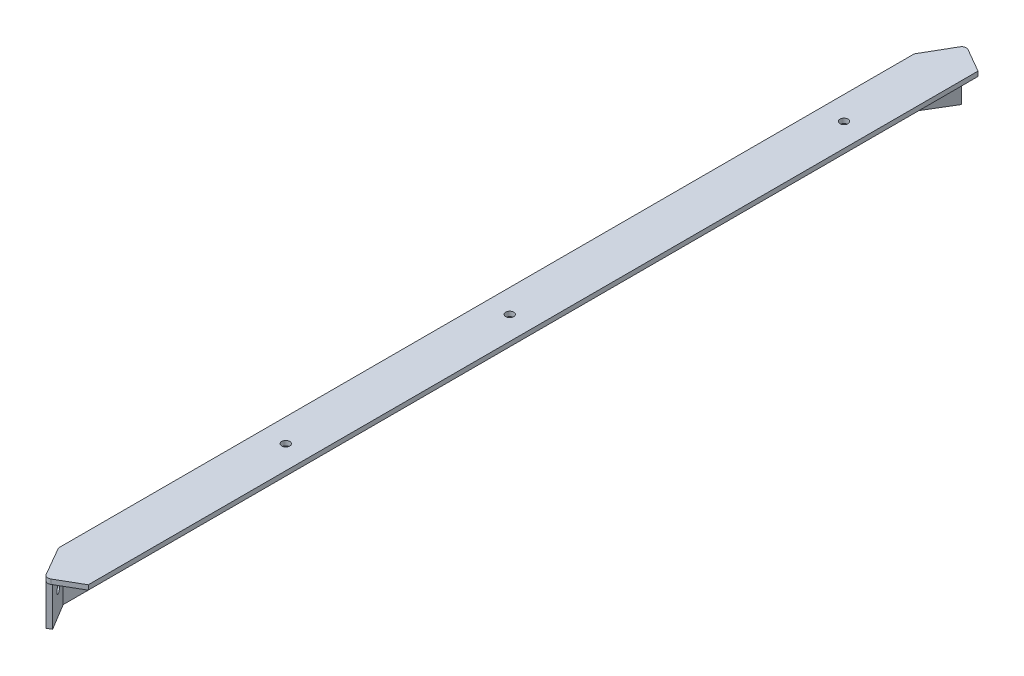
ISO-10303-21;
HEADER;
FILE_DESCRIPTION(('STEP AP214'),'2;1');
FILE_NAME('part.step','',(''),(''),'','','');
FILE_SCHEMA(('AUTOMOTIVE_DESIGN { 1 0 10303 214 1 1 1 1 }'));
ENDSEC;
DATA;
#1=APPLICATION_CONTEXT('core data for automotive mechanical design processes');
#2=APPLICATION_PROTOCOL_DEFINITION('international standard','automotive_design',2000,#1);
#3=PRODUCT_CONTEXT('',#1,'mechanical');
#4=PRODUCT('Part','Part','',(#3));
#5=PRODUCT_RELATED_PRODUCT_CATEGORY('part','',(#4));
#6=PRODUCT_DEFINITION_FORMATION('','',#4);
#7=PRODUCT_DEFINITION_CONTEXT('part definition',#1,'design');
#8=PRODUCT_DEFINITION('design','',#6,#7);
#9=PRODUCT_DEFINITION_SHAPE('','',#8);
#10=(LENGTH_UNIT() NAMED_UNIT(*) SI_UNIT(.MILLI.,.METRE.));
#11=(NAMED_UNIT(*) PLANE_ANGLE_UNIT() SI_UNIT($,.RADIAN.));
#12=(NAMED_UNIT(*) SI_UNIT($,.STERADIAN.) SOLID_ANGLE_UNIT());
#13=UNCERTAINTY_MEASURE_WITH_UNIT(LENGTH_MEASURE(1.E-05),#10,'distance_accuracy_value','');
#14=(GEOMETRIC_REPRESENTATION_CONTEXT(3) GLOBAL_UNCERTAINTY_ASSIGNED_CONTEXT((#13)) GLOBAL_UNIT_ASSIGNED_CONTEXT((#10,
#11,#12)) REPRESENTATION_CONTEXT('',''));
#15=CARTESIAN_POINT('',(0.,0.,0.));
#16=DIRECTION('',(0.,0.,1.));
#17=DIRECTION('',(1.,0.,0.));
#18=AXIS2_PLACEMENT_3D('',#15,#16,#17);
#19=CARTESIAN_POINT('',(7.,0.,640.));
#20=DIRECTION('',(0.,1.,0.));
#21=DIRECTION('',(-1.,0.,0.));
#22=AXIS2_PLACEMENT_3D('',#19,#20,#21);
#23=PLANE('',#22);
#24=DIRECTION('',(0.,0.,-1.));
#25=VECTOR('',#24,1.);
#26=CARTESIAN_POINT('',(0.,0.,640.));
#27=LINE('',#26,#25);
#28=CARTESIAN_POINT('',(0.,0.,640.));
#29=VERTEX_POINT('',#28);
#30=CARTESIAN_POINT('',(0.,0.,-640.));
#31=VERTEX_POINT('',#30);
#32=EDGE_CURVE('E305',#29,#31,#27,.T.);
#33=ORIENTED_EDGE('',*,*,#32,.T.);
#34=DIRECTION('',(0.499999999999995,0.,-0.866025403784441));
#35=VECTOR('',#34,1.);
#36=CARTESIAN_POINT('',(0.,0.,-640.));
#37=LINE('',#36,#35);
#38=CARTESIAN_POINT('',(24.9999999999997,0.,-683.301270189222));
#39=VERTEX_POINT('',#38);
#40=EDGE_CURVE('E164',#31,#39,#37,.T.);
#41=ORIENTED_EDGE('',*,*,#40,.T.);
#42=DIRECTION('',(0.86602540378444,0.,0.499999999999997));
#43=VECTOR('',#42,1.);
#44=CARTESIAN_POINT('',(24.9999999999997,0.,-683.301270189222));
#45=LINE('',#44,#43);
#46=CARTESIAN_POINT('',(31.0621778264906,0.,-679.801270189222));
#47=VERTEX_POINT('',#46);
#48=EDGE_CURVE('E208',#39,#47,#45,.T.);
#49=ORIENTED_EDGE('',*,*,#48,.T.);
#50=DIRECTION('',(-0.517360980401763,0.,0.855767267402608));
#51=VECTOR('',#50,1.);
#52=CARTESIAN_POINT('',(31.0621778264906,0.,-679.801270189222));
#53=LINE('',#52,#51);
#54=CARTESIAN_POINT('',(7.,0.,-640.));
#55=VERTEX_POINT('',#54);
#56=EDGE_CURVE('E204',#47,#55,#53,.T.);
#57=ORIENTED_EDGE('',*,*,#56,.T.);
#58=DIRECTION('',(0.,0.,-1.));
#59=VECTOR('',#58,1.);
#60=CARTESIAN_POINT('',(7.,0.,640.));
#61=LINE('',#60,#59);
#62=CARTESIAN_POINT('',(7.,0.,640.));
#63=VERTEX_POINT('',#62);
#64=EDGE_CURVE('E317',#63,#55,#61,.T.);
#65=ORIENTED_EDGE('',*,*,#64,.F.);
#66=DIRECTION('',(-0.517360980401763,0.,-0.855767267402608));
#67=VECTOR('',#66,1.);
#68=CARTESIAN_POINT('',(31.0621778264906,0.,679.801270189222));
#69=LINE('',#68,#67);
#70=CARTESIAN_POINT('',(31.0621778264906,0.,679.801270189222));
#71=VERTEX_POINT('',#70);
#72=EDGE_CURVE('E283',#71,#63,#69,.T.);
#73=ORIENTED_EDGE('',*,*,#72,.F.);
#74=DIRECTION('',(0.86602540378444,0.,-0.499999999999997));
#75=VECTOR('',#74,1.);
#76=CARTESIAN_POINT('',(24.9999999999997,0.,683.301270189222));
#77=LINE('',#76,#75);
#78=CARTESIAN_POINT('',(24.9999999999997,0.,683.301270189222));
#79=VERTEX_POINT('',#78);
#80=EDGE_CURVE('E286',#79,#71,#77,.T.);
#81=ORIENTED_EDGE('',*,*,#80,.F.);
#82=DIRECTION('',(0.499999999999995,0.,0.866025403784441));
#83=VECTOR('',#82,1.);
#84=CARTESIAN_POINT('',(0.,0.,640.));
#85=LINE('',#84,#83);
#86=EDGE_CURVE('E278',#29,#79,#85,.T.);
#87=ORIENTED_EDGE('',*,*,#86,.F.);
#88=EDGE_LOOP('',(#33,#41,#49,#57,#65,#73,#81,#87));
#89=FACE_BOUND('',#88,.T.);
#90=ADVANCED_FACE('F44',(#89),#23,.F.);
#91=CARTESIAN_POINT('',(6.99999999999999,63.,640.));
#92=DIRECTION('',(-1.,0.,0.));
#93=DIRECTION('',(0.,-1.,0.));
#94=AXIS2_PLACEMENT_3D('',#91,#92,#93);
#95=PLANE('',#94);
#96=ORIENTED_EDGE('',*,*,#64,.T.);
#97=DIRECTION('',(0.,1.,0.));
#98=VECTOR('',#97,1.);
#99=CARTESIAN_POINT('',(6.99999999999999,63.,-640.));
#100=LINE('',#99,#98);
#101=CARTESIAN_POINT('',(6.99999999999999,58.,-640.));
#102=VERTEX_POINT('',#101);
#103=EDGE_CURVE('E220',#55,#102,#100,.T.);
#104=ORIENTED_EDGE('',*,*,#103,.T.);
#105=DIRECTION('',(0.,0.,-1.));
#106=VECTOR('',#105,1.);
#107=CARTESIAN_POINT('',(6.99999999999999,58.,640.));
#108=LINE('',#107,#106);
#109=CARTESIAN_POINT('',(6.99999999999999,58.,640.));
#110=VERTEX_POINT('',#109);
#111=EDGE_CURVE('E54',#102,#110,#108,.F.);
#112=ORIENTED_EDGE('',*,*,#111,.T.);
#113=DIRECTION('',(0.,1.,0.));
#114=VECTOR('',#113,1.);
#115=CARTESIAN_POINT('',(6.99999999999999,63.,640.));
#116=LINE('',#115,#114);
#117=EDGE_CURVE('E299',#63,#110,#116,.T.);
#118=ORIENTED_EDGE('',*,*,#117,.F.);
#119=EDGE_LOOP('',(#96,#104,#112,#118));
#120=FACE_BOUND('',#119,.T.);
#121=ADVANCED_FACE('F355',(#120),#95,.F.);
#122=CARTESIAN_POINT('',(70.,63.,640.));
#123=DIRECTION('',(0.,1.,0.));
#124=DIRECTION('',(-1.,0.,0.));
#125=AXIS2_PLACEMENT_3D('',#122,#123,#124);
#126=PLANE('',#125);
#127=CARTESIAN_POINT('',(35.,63.,335.));
#128=DIRECTION('',(0.,1.,0.));
#129=DIRECTION('',(-1.,0.,0.));
#130=AXIS2_PLACEMENT_3D('',#127,#128,#129);
#131=CIRCLE('',#130,6.);
#132=CARTESIAN_POINT('',(29.,63.,335.));
#133=VERTEX_POINT('',#132);
#134=EDGE_CURVE('E240',#133,#133,#131,.T.);
#135=ORIENTED_EDGE('',*,*,#134,.T.);
#136=EDGE_LOOP('',(#135));
#137=FACE_BOUND('',#136,.T.);
#138=CARTESIAN_POINT('',(35.,63.,-500.));
#139=DIRECTION('',(0.,1.,0.));
#140=DIRECTION('',(-1.,0.,0.));
#141=AXIS2_PLACEMENT_3D('',#138,#139,#140);
#142=CIRCLE('',#141,6.);
#143=CARTESIAN_POINT('',(29.,63.,-500.));
#144=VERTEX_POINT('',#143);
#145=EDGE_CURVE('E551',#144,#144,#142,.T.);
#146=ORIENTED_EDGE('',*,*,#145,.T.);
#147=EDGE_LOOP('',(#146));
#148=FACE_BOUND('',#147,.T.);
#149=CARTESIAN_POINT('',(35.,63.,0.));
#150=DIRECTION('',(0.,1.,0.));
#151=DIRECTION('',(-1.,0.,0.));
#152=AXIS2_PLACEMENT_3D('',#149,#150,#151);
#153=CIRCLE('',#152,6.);
#154=CARTESIAN_POINT('',(29.,63.,0.));
#155=VERTEX_POINT('',#154);
#156=EDGE_CURVE('E555',#155,#155,#153,.T.);
#157=ORIENTED_EDGE('',*,*,#156,.T.);
#158=EDGE_LOOP('',(#157));
#159=FACE_BOUND('',#158,.T.);
#160=DIRECTION('',(0.86602540378444,0.,-0.499999999999997));
#161=VECTOR('',#160,1.);
#162=CARTESIAN_POINT('',(24.9999999999997,63.,683.301270189222));
#163=LINE('',#162,#161);
#164=CARTESIAN_POINT('',(24.9999999999997,63.,683.301270189222));
#165=VERTEX_POINT('',#164);
#166=CARTESIAN_POINT('',(35.3931854107218,63.,677.300761794604));
#167=VERTEX_POINT('',#166);
#168=EDGE_CURVE('E279',#165,#167,#163,.T.);
#169=ORIENTED_EDGE('',*,*,#168,.T.);
#170=DIRECTION('',(-0.517360980401763,0.,-0.855767267402608));
#171=VECTOR('',#170,1.);
#172=CARTESIAN_POINT('',(11.278836337013,63.,637.413195097991));
#173=LINE('',#172,#171);
#174=CARTESIAN_POINT('',(12.,63.,638.606072567694));
#175=VERTEX_POINT('',#174);
#176=EDGE_CURVE('E323',#167,#175,#173,.T.);
#177=ORIENTED_EDGE('',*,*,#176,.T.);
#178=DIRECTION('',(0.,0.,-1.));
#179=VECTOR('',#178,1.);
#180=CARTESIAN_POINT('',(12.,63.,0.));
#181=LINE('',#180,#179);
#182=CARTESIAN_POINT('',(12.,63.,-638.606072567694));
#183=VERTEX_POINT('',#182);
#184=EDGE_CURVE('E320',#175,#183,#181,.T.);
#185=ORIENTED_EDGE('',*,*,#184,.T.);
#186=DIRECTION('',(-0.517360980401763,0.,0.855767267402608));
#187=VECTOR('',#186,1.);
#188=CARTESIAN_POINT('',(11.278836337013,63.,-637.413195097991));
#189=LINE('',#188,#187);
#190=CARTESIAN_POINT('',(35.3931854107218,63.,-677.300761794604));
#191=VERTEX_POINT('',#190);
#192=EDGE_CURVE('E225',#191,#183,#189,.T.);
#193=ORIENTED_EDGE('',*,*,#192,.F.);
#194=DIRECTION('',(0.86602540378444,0.,0.499999999999997));
#195=VECTOR('',#194,1.);
#196=CARTESIAN_POINT('',(24.9999999999997,63.,-683.301270189222));
#197=LINE('',#196,#195);
#198=CARTESIAN_POINT('',(24.9999999999997,63.,-683.301270189222));
#199=VERTEX_POINT('',#198);
#200=EDGE_CURVE('E199',#199,#191,#197,.T.);
#201=ORIENTED_EDGE('',*,*,#200,.F.);
#202=CARTESIAN_POINT('',(31.0621778264908,63.,-679.801270189222));
#203=DIRECTION('',(0.,-1.,0.));
#204=DIRECTION('',(0.,0.,-1.));
#205=AXIS2_PLACEMENT_3D('',#202,#203,#204);
#206=CIRCLE('',#205,7.00000000000002);
#207=CARTESIAN_POINT('',(34.5621778264908,63.,-685.863448015713));
#208=VERTEX_POINT('',#207);
#209=EDGE_CURVE('E160',#199,#208,#206,.T.);
#210=ORIENTED_EDGE('',*,*,#209,.T.);
#211=DIRECTION('',(0.866025403784439,0.,0.499999999999999));
#212=VECTOR('',#211,1.);
#213=CARTESIAN_POINT('',(34.5621778264908,63.,-685.863448015713));
#214=LINE('',#213,#212);
#215=CARTESIAN_POINT('',(69.9999999999999,63.,-665.403411844344));
#216=VERTEX_POINT('',#215);
#217=EDGE_CURVE('E176',#208,#216,#214,.T.);
#218=ORIENTED_EDGE('',*,*,#217,.T.);
#219=DIRECTION('',(0.,0.,-1.));
#220=VECTOR('',#219,1.);
#221=CARTESIAN_POINT('',(70.,63.,640.));
#222=LINE('',#221,#220);
#223=CARTESIAN_POINT('',(69.9999999999999,63.,665.403411844344));
#224=VERTEX_POINT('',#223);
#225=EDGE_CURVE('E314',#224,#216,#222,.T.);
#226=ORIENTED_EDGE('',*,*,#225,.F.);
#227=DIRECTION('',(0.866025403784439,0.,-0.499999999999999));
#228=VECTOR('',#227,1.);
#229=CARTESIAN_POINT('',(34.5621778264908,63.,685.863448015713));
#230=LINE('',#229,#228);
#231=CARTESIAN_POINT('',(34.5621778264908,63.,685.863448015713));
#232=VERTEX_POINT('',#231);
#233=EDGE_CURVE('E254',#232,#224,#230,.T.);
#234=ORIENTED_EDGE('',*,*,#233,.F.);
#235=CARTESIAN_POINT('',(31.0621778264908,63.,679.801270189222));
#236=DIRECTION('',(0.,1.,0.));
#237=DIRECTION('',(0.,0.,1.));
#238=AXIS2_PLACEMENT_3D('',#235,#236,#237);
#239=CIRCLE('',#238,7.00000000000002);
#240=EDGE_CURVE('E249',#165,#232,#239,.T.);
#241=ORIENTED_EDGE('',*,*,#240,.F.);
#242=EDGE_LOOP('',(#169,#177,#185,#193,#201,#210,#218,#226,#234,#241));
#243=FACE_BOUND('',#242,.T.);
#244=ADVANCED_FACE('F341',(#137,#148,#159,#243),#126,.F.);
#245=CARTESIAN_POINT('',(70.,70.,640.));
#246=DIRECTION('',(-1.,0.,0.));
#247=DIRECTION('',(0.,0.,1.));
#248=AXIS2_PLACEMENT_3D('',#245,#246,#247);
#249=PLANE('',#248);
#250=ORIENTED_EDGE('',*,*,#225,.T.);
#251=DIRECTION('',(0.,-1.,0.));
#252=VECTOR('',#251,1.);
#253=CARTESIAN_POINT('',(69.9999999999999,70.,-665.403411844344));
#254=LINE('',#253,#252);
#255=CARTESIAN_POINT('',(69.9999999999999,70.,-665.403411844344));
#256=VERTEX_POINT('',#255);
#257=EDGE_CURVE('E184',#256,#216,#254,.T.);
#258=ORIENTED_EDGE('',*,*,#257,.F.);
#259=DIRECTION('',(0.,0.,-1.));
#260=VECTOR('',#259,1.);
#261=CARTESIAN_POINT('',(70.,70.,640.));
#262=LINE('',#261,#260);
#263=CARTESIAN_POINT('',(69.9999999999999,70.,665.403411844344));
#264=VERTEX_POINT('',#263);
#265=EDGE_CURVE('E311',#264,#256,#262,.T.);
#266=ORIENTED_EDGE('',*,*,#265,.F.);
#267=DIRECTION('',(0.,-1.,0.));
#268=VECTOR('',#267,1.);
#269=CARTESIAN_POINT('',(69.9999999999999,70.,665.403411844344));
#270=LINE('',#269,#268);
#271=EDGE_CURVE('E261',#264,#224,#270,.T.);
#272=ORIENTED_EDGE('',*,*,#271,.T.);
#273=EDGE_LOOP('',(#250,#258,#266,#272));
#274=FACE_BOUND('',#273,.T.);
#275=ADVANCED_FACE('F387',(#274),#249,.F.);
#276=CARTESIAN_POINT('',(0.,70.,640.));
#277=DIRECTION('',(0.,-1.,0.));
#278=DIRECTION('',(0.,0.,-1.));
#279=AXIS2_PLACEMENT_3D('',#276,#277,#278);
#280=PLANE('',#279);
#281=CARTESIAN_POINT('',(35.,70.,335.));
#282=DIRECTION('',(0.,1.,0.));
#283=DIRECTION('',(0.,0.,1.));
#284=AXIS2_PLACEMENT_3D('',#281,#282,#283);
#285=CIRCLE('',#284,6.);
#286=CARTESIAN_POINT('',(35.,70.,341.));
#287=VERTEX_POINT('',#286);
#288=EDGE_CURVE('E547',#287,#287,#285,.T.);
#289=ORIENTED_EDGE('',*,*,#288,.F.);
#290=EDGE_LOOP('',(#289));
#291=FACE_BOUND('',#290,.T.);
#292=CARTESIAN_POINT('',(35.,70.,-500.));
#293=DIRECTION('',(0.,1.,0.));
#294=DIRECTION('',(0.,0.,1.));
#295=AXIS2_PLACEMENT_3D('',#292,#293,#294);
#296=CIRCLE('',#295,6.);
#297=CARTESIAN_POINT('',(35.,70.,-494.));
#298=VERTEX_POINT('',#297);
#299=EDGE_CURVE('E573',#298,#298,#296,.T.);
#300=ORIENTED_EDGE('',*,*,#299,.F.);
#301=EDGE_LOOP('',(#300));
#302=FACE_BOUND('',#301,.T.);
#303=CARTESIAN_POINT('',(35.,70.,0.));
#304=DIRECTION('',(0.,1.,0.));
#305=DIRECTION('',(0.,0.,1.));
#306=AXIS2_PLACEMENT_3D('',#303,#304,#305);
#307=CIRCLE('',#306,6.);
#308=CARTESIAN_POINT('',(35.,70.,6.));
#309=VERTEX_POINT('',#308);
#310=EDGE_CURVE('E569',#309,#309,#307,.T.);
#311=ORIENTED_EDGE('',*,*,#310,.F.);
#312=EDGE_LOOP('',(#311));
#313=FACE_BOUND('',#312,.T.);
#314=ORIENTED_EDGE('',*,*,#265,.T.);
#315=DIRECTION('',(0.866025403784439,0.,0.499999999999999));
#316=VECTOR('',#315,1.);
#317=CARTESIAN_POINT('',(34.5621778264908,70.,-685.863448015713));
#318=LINE('',#317,#316);
#319=CARTESIAN_POINT('',(34.5621778264908,70.,-685.863448015713));
#320=VERTEX_POINT('',#319);
#321=EDGE_CURVE('E180',#320,#256,#318,.T.);
#322=ORIENTED_EDGE('',*,*,#321,.F.);
#323=CARTESIAN_POINT('',(31.0621778264908,70.,-679.801270189222));
#324=DIRECTION('',(0.,-1.,0.));
#325=DIRECTION('',(0.,0.,-1.));
#326=AXIS2_PLACEMENT_3D('',#323,#324,#325);
#327=CIRCLE('',#326,7.00000000000002);
#328=CARTESIAN_POINT('',(24.9999999999997,70.,-683.301270189222));
#329=VERTEX_POINT('',#328);
#330=EDGE_CURVE('E157',#329,#320,#327,.T.);
#331=ORIENTED_EDGE('',*,*,#330,.F.);
#332=DIRECTION('',(0.499999999999996,0.,-0.866025403784441));
#333=VECTOR('',#332,1.);
#334=CARTESIAN_POINT('',(0.,70.,-640.));
#335=LINE('',#334,#333);
#336=CARTESIAN_POINT('',(0.,70.,-640.));
#337=VERTEX_POINT('',#336);
#338=EDGE_CURVE('E169',#337,#329,#335,.T.);
#339=ORIENTED_EDGE('',*,*,#338,.F.);
#340=DIRECTION('',(0.,0.,-1.));
#341=VECTOR('',#340,1.);
#342=CARTESIAN_POINT('',(0.,70.,640.));
#343=LINE('',#342,#341);
#344=CARTESIAN_POINT('',(0.,70.,640.));
#345=VERTEX_POINT('',#344);
#346=EDGE_CURVE('E308',#345,#337,#343,.T.);
#347=ORIENTED_EDGE('',*,*,#346,.F.);
#348=DIRECTION('',(0.499999999999996,0.,0.866025403784441));
#349=VECTOR('',#348,1.);
#350=CARTESIAN_POINT('',(0.,70.,640.));
#351=LINE('',#350,#349);
#352=CARTESIAN_POINT('',(24.9999999999997,70.,683.301270189222));
#353=VERTEX_POINT('',#352);
#354=EDGE_CURVE('E250',#345,#353,#351,.T.);
#355=ORIENTED_EDGE('',*,*,#354,.T.);
#356=CARTESIAN_POINT('',(31.0621778264908,70.,679.801270189222));
#357=DIRECTION('',(0.,1.,0.));
#358=DIRECTION('',(0.,0.,1.));
#359=AXIS2_PLACEMENT_3D('',#356,#357,#358);
#360=CIRCLE('',#359,7.00000000000002);
#361=CARTESIAN_POINT('',(34.5621778264908,70.,685.863448015713));
#362=VERTEX_POINT('',#361);
#363=EDGE_CURVE('E253',#353,#362,#360,.T.);
#364=ORIENTED_EDGE('',*,*,#363,.T.);
#365=DIRECTION('',(0.866025403784439,0.,-0.499999999999999));
#366=VECTOR('',#365,1.);
#367=CARTESIAN_POINT('',(34.5621778264908,70.,685.863448015713));
#368=LINE('',#367,#366);
#369=EDGE_CURVE('E257',#362,#264,#368,.T.);
#370=ORIENTED_EDGE('',*,*,#369,.T.);
#371=EDGE_LOOP('',(#314,#322,#331,#339,#347,#355,#364,#370));
#372=FACE_BOUND('',#371,.T.);
#373=ADVANCED_FACE('F178',(#291,#302,#313,#372),#280,.F.);
#374=CARTESIAN_POINT('',(0.,0.,640.));
#375=DIRECTION('',(1.,0.,0.));
#376=DIRECTION('',(0.,0.,-1.));
#377=AXIS2_PLACEMENT_3D('',#374,#375,#376);
#378=PLANE('',#377);
#379=ORIENTED_EDGE('',*,*,#346,.T.);
#380=DIRECTION('',(0.,-1.,0.));
#381=VECTOR('',#380,1.);
#382=CARTESIAN_POINT('',(0.,0.,-640.));
#383=LINE('',#382,#381);
#384=EDGE_CURVE('E173',#337,#31,#383,.T.);
#385=ORIENTED_EDGE('',*,*,#384,.T.);
#386=ORIENTED_EDGE('',*,*,#32,.F.);
#387=DIRECTION('',(0.,-1.,0.));
#388=VECTOR('',#387,1.);
#389=CARTESIAN_POINT('',(0.,0.,640.));
#390=LINE('',#389,#388);
#391=EDGE_CURVE('E302',#345,#29,#390,.T.);
#392=ORIENTED_EDGE('',*,*,#391,.F.);
#393=EDGE_LOOP('',(#379,#385,#386,#392));
#394=FACE_BOUND('',#393,.T.);
#395=ADVANCED_FACE('F369',(#394),#378,.F.);
#396=CARTESIAN_POINT('',(0.,63.,640.));
#397=DIRECTION('',(0.866025403784441,0.,-0.499999999999995));
#398=DIRECTION('',(-0.499999999999995,0.,-0.866025403784441));
#399=AXIS2_PLACEMENT_3D('',#396,#397,#398);
#400=PLANE('',#399);
#401=CARTESIAN_POINT('',(12.5680467926569,35.,661.768495596785));
#402=DIRECTION('',(0.866025403784441,0.,-0.499999999999995));
#403=DIRECTION('',(-0.499999999999995,0.,-0.866025403784441));
#404=AXIS2_PLACEMENT_3D('',#401,#402,#403);
#405=ELLIPSE('',#404,6.00122014708363,5.99999999999997);
#406=CARTESIAN_POINT('',(9.56743671911515,35.,656.571286495708));
#407=VERTEX_POINT('',#406);
#408=EDGE_CURVE('E245',#407,#407,#405,.T.);
#409=ORIENTED_EDGE('',*,*,#408,.T.);
#410=EDGE_LOOP('',(#409));
#411=FACE_BOUND('',#410,.T.);
#412=ORIENTED_EDGE('',*,*,#86,.T.);
#413=DIRECTION('',(0.,-1.,0.));
#414=VECTOR('',#413,1.);
#415=CARTESIAN_POINT('',(24.9999999999997,63.,683.301270189222));
#416=LINE('',#415,#414);
#417=EDGE_CURVE('E295',#165,#79,#416,.T.);
#418=ORIENTED_EDGE('',*,*,#417,.F.);
#419=DIRECTION('',(0.,-1.,0.));
#420=VECTOR('',#419,1.);
#421=CARTESIAN_POINT('',(24.9999999999997,70.,683.301270189222));
#422=LINE('',#421,#420);
#423=EDGE_CURVE('E274',#353,#165,#422,.T.);
#424=ORIENTED_EDGE('',*,*,#423,.F.);
#425=ORIENTED_EDGE('',*,*,#354,.F.);
#426=ORIENTED_EDGE('',*,*,#391,.T.);
#427=EDGE_LOOP('',(#412,#418,#424,#425,#426));
#428=FACE_BOUND('',#427,.T.);
#429=ADVANCED_FACE('F375',(#411,#428),#400,.F.);
#430=CARTESIAN_POINT('',(24.9999999999997,63.,683.301270189222));
#431=DIRECTION('',(-0.499999999999997,0.,-0.86602540378444));
#432=DIRECTION('',(-0.86602540378444,0.,0.499999999999997));
#433=AXIS2_PLACEMENT_3D('',#430,#431,#432);
#434=PLANE('',#433);
#435=ORIENTED_EDGE('',*,*,#80,.T.);
#436=DIRECTION('',(0.,-1.,0.));
#437=VECTOR('',#436,1.);
#438=CARTESIAN_POINT('',(31.0621778264906,63.,679.801270189222));
#439=LINE('',#438,#437);
#440=CARTESIAN_POINT('',(31.0621778264906,58.,679.801270189222));
#441=VERTEX_POINT('',#440);
#442=EDGE_CURVE('E282',#441,#71,#439,.T.);
#443=ORIENTED_EDGE('',*,*,#442,.F.);
#444=CARTESIAN_POINT('',(35.3931854107218,58.,677.300761794604));
#445=DIRECTION('',(-0.499999999999997,0.,-0.86602540378444));
#446=DIRECTION('',(0.86602540378444,0.,-0.499999999999997));
#447=AXIS2_PLACEMENT_3D('',#444,#445,#446);
#448=ELLIPSE('',#447,5.00101678923638,5.);
#449=EDGE_CURVE('E11',#441,#167,#448,.T.);
#450=ORIENTED_EDGE('',*,*,#449,.T.);
#451=ORIENTED_EDGE('',*,*,#168,.F.);
#452=ORIENTED_EDGE('',*,*,#417,.T.);
#453=EDGE_LOOP('',(#435,#443,#450,#451,#452));
#454=FACE_BOUND('',#453,.T.);
#455=ADVANCED_FACE('F346',(#454),#434,.F.);
#456=CARTESIAN_POINT('',(31.0621778264906,63.,679.801270189222));
#457=DIRECTION('',(-0.855767267402608,0.,0.517360980401763));
#458=DIRECTION('',(0.517360980401763,0.,0.855767267402608));
#459=AXIS2_PLACEMENT_3D('',#456,#457,#458);
#460=PLANE('',#459);
#461=CARTESIAN_POINT('',(18.1281533164464,35.,658.407088504157));
#462=DIRECTION('',(0.855767267402608,0.,-0.517360980401763));
#463=DIRECTION('',(-0.517360980401763,0.,-0.855767267402608));
#464=AXIS2_PLACEMENT_3D('',#461,#462,#463);
#465=CIRCLE('',#464,5.99999999999997);
#466=CARTESIAN_POINT('',(15.0239874340358,35.,653.272484899742));
#467=VERTEX_POINT('',#466);
#468=EDGE_CURVE('E241',#467,#467,#465,.T.);
#469=ORIENTED_EDGE('',*,*,#468,.F.);
#470=EDGE_LOOP('',(#469));
#471=FACE_BOUND('',#470,.T.);
#472=ORIENTED_EDGE('',*,*,#117,.T.);
#473=DIRECTION('',(-0.517360980401763,0.,-0.855767267402608));
#474=VECTOR('',#473,1.);
#475=CARTESIAN_POINT('',(31.0621778264906,58.,679.801270189222));
#476=LINE('',#475,#474);
#477=EDGE_CURVE('E61',#110,#441,#476,.F.);
#478=ORIENTED_EDGE('',*,*,#477,.T.);
#479=ORIENTED_EDGE('',*,*,#442,.T.);
#480=ORIENTED_EDGE('',*,*,#72,.T.);
#481=EDGE_LOOP('',(#472,#478,#479,#480));
#482=FACE_BOUND('',#481,.T.);
#483=ADVANCED_FACE('F349',(#471,#482),#460,.F.);
#484=CARTESIAN_POINT('',(31.0621778264908,70.,679.801270189222));
#485=DIRECTION('',(0.,-1.,0.));
#486=DIRECTION('',(0.,0.,-1.));
#487=AXIS2_PLACEMENT_3D('',#484,#485,#486);
#488=CYLINDRICAL_SURFACE('',#487,7.00000000000002);
#489=ORIENTED_EDGE('',*,*,#240,.T.);
#490=DIRECTION('',(0.,-1.,0.));
#491=VECTOR('',#490,1.);
#492=CARTESIAN_POINT('',(34.5621778264908,70.,685.863448015713));
#493=LINE('',#492,#491);
#494=EDGE_CURVE('E270',#362,#232,#493,.T.);
#495=ORIENTED_EDGE('',*,*,#494,.F.);
#496=ORIENTED_EDGE('',*,*,#363,.F.);
#497=ORIENTED_EDGE('',*,*,#423,.T.);
#498=EDGE_LOOP('',(#489,#495,#496,#497));
#499=FACE_BOUND('',#498,.T.);
#500=ADVANCED_FACE('F377',(#499),#488,.T.);
#501=CARTESIAN_POINT('',(34.5621778264908,70.,685.863448015713));
#502=DIRECTION('',(-0.499999999999999,0.,-0.866025403784439));
#503=DIRECTION('',(-0.86602540378444,0.,0.499999999999999));
#504=AXIS2_PLACEMENT_3D('',#501,#502,#503);
#505=PLANE('',#504);
#506=ORIENTED_EDGE('',*,*,#233,.T.);
#507=ORIENTED_EDGE('',*,*,#271,.F.);
#508=ORIENTED_EDGE('',*,*,#369,.F.);
#509=ORIENTED_EDGE('',*,*,#494,.T.);
#510=EDGE_LOOP('',(#506,#507,#508,#509));
#511=FACE_BOUND('',#510,.T.);
#512=ADVANCED_FACE('F381',(#511),#505,.F.);
#513=CARTESIAN_POINT('',(12.1377824446282,35.,662.02861536697));
#514=DIRECTION('',(0.855767267402608,0.,-0.517360980401763));
#515=DIRECTION('',(-0.517360980401763,0.,-0.855767267402608));
#516=AXIS2_PLACEMENT_3D('',#513,#514,#515);
#517=CYLINDRICAL_SURFACE('',#516,5.99999999999997);
#518=ORIENTED_EDGE('',*,*,#468,.T.);
#519=EDGE_LOOP('',(#518));
#520=FACE_BOUND('',#519,.T.);
#521=ORIENTED_EDGE('',*,*,#408,.F.);
#522=EDGE_LOOP('',(#521));
#523=FACE_BOUND('',#522,.T.);
#524=ADVANCED_FACE('F415',(#520,#523),#517,.F.);
#525=CARTESIAN_POINT('',(12.,58.,640.));
#526=DIRECTION('',(0.,0.,1.));
#527=DIRECTION('',(1.,0.,0.));
#528=AXIS2_PLACEMENT_3D('',#525,#526,#527);
#529=CYLINDRICAL_SURFACE('',#528,5.);
#530=ORIENTED_EDGE('',*,*,#111,.F.);
#531=CARTESIAN_POINT('',(12.,58.,-638.606072567694));
#532=DIRECTION('',(-0.268544905553422,0.,0.963267166315402));
#533=DIRECTION('',(0.963267166315402,0.,0.268544905553422));
#534=AXIS2_PLACEMENT_3D('',#531,#532,#533);
#535=ELLIPSE('',#534,5.19066794223406,5.);
#536=EDGE_CURVE('E235',#102,#183,#535,.F.);
#537=ORIENTED_EDGE('',*,*,#536,.T.);
#538=ORIENTED_EDGE('',*,*,#184,.F.);
#539=CARTESIAN_POINT('',(12.,58.,638.606072567694));
#540=DIRECTION('',(0.268544905553422,0.,0.963267166315402));
#541=DIRECTION('',(0.963267166315402,0.,-0.268544905553422));
#542=AXIS2_PLACEMENT_3D('',#539,#540,#541);
#543=ELLIPSE('',#542,5.19066794223406,5.);
#544=EDGE_CURVE('E48',#110,#175,#543,.F.);
#545=ORIENTED_EDGE('',*,*,#544,.F.);
#546=EDGE_LOOP('',(#530,#537,#538,#545));
#547=FACE_BOUND('',#546,.T.);
#548=ADVANCED_FACE('F46',(#547),#529,.F.);
#549=CARTESIAN_POINT('',(28.1415665316763,58.,665.305852422918));
#550=DIRECTION('',(0.517360980401763,0.,0.855767267402608));
#551=DIRECTION('',(0.855767267402608,0.,-0.517360980401763));
#552=AXIS2_PLACEMENT_3D('',#549,#550,#551);
#553=CYLINDRICAL_SURFACE('',#552,5.);
#554=ORIENTED_EDGE('',*,*,#449,.F.);
#555=ORIENTED_EDGE('',*,*,#477,.F.);
#556=ORIENTED_EDGE('',*,*,#544,.T.);
#557=ORIENTED_EDGE('',*,*,#176,.F.);
#558=EDGE_LOOP('',(#554,#555,#556,#557));
#559=FACE_BOUND('',#558,.T.);
#560=ADVANCED_FACE('F336',(#559),#553,.F.);
#561=CARTESIAN_POINT('',(0.,63.,-640.));
#562=DIRECTION('',(0.866025403784441,0.,0.499999999999995));
#563=DIRECTION('',(-0.499999999999995,0.,0.866025403784441));
#564=AXIS2_PLACEMENT_3D('',#561,#562,#563);
#565=PLANE('',#564);
#566=CARTESIAN_POINT('',(12.5680467926569,35.,-661.768495596785));
#567=DIRECTION('',(-0.866025403784441,0.,-0.499999999999995));
#568=DIRECTION('',(-0.499999999999995,0.,0.866025403784441));
#569=AXIS2_PLACEMENT_3D('',#566,#567,#568);
#570=ELLIPSE('',#569,6.00122014708363,5.99999999999997);
#571=CARTESIAN_POINT('',(9.56743671911515,35.,-656.571286495708));
#572=VERTEX_POINT('',#571);
#573=EDGE_CURVE('E190',#572,#572,#570,.T.);
#574=ORIENTED_EDGE('',*,*,#573,.F.);
#575=EDGE_LOOP('',(#574));
#576=FACE_BOUND('',#575,.T.);
#577=ORIENTED_EDGE('',*,*,#40,.F.);
#578=ORIENTED_EDGE('',*,*,#384,.F.);
#579=ORIENTED_EDGE('',*,*,#338,.T.);
#580=DIRECTION('',(0.,-1.,0.));
#581=VECTOR('',#580,1.);
#582=CARTESIAN_POINT('',(24.9999999999997,70.,-683.301270189222));
#583=LINE('',#582,#581);
#584=EDGE_CURVE('E153',#329,#199,#583,.T.);
#585=ORIENTED_EDGE('',*,*,#584,.T.);
#586=DIRECTION('',(0.,-1.,0.));
#587=VECTOR('',#586,1.);
#588=CARTESIAN_POINT('',(24.9999999999997,63.,-683.301270189222));
#589=LINE('',#588,#587);
#590=EDGE_CURVE('E217',#199,#39,#589,.T.);
#591=ORIENTED_EDGE('',*,*,#590,.T.);
#592=EDGE_LOOP('',(#577,#578,#579,#585,#591));
#593=FACE_BOUND('',#592,.T.);
#594=ADVANCED_FACE('F171',(#576,#593),#565,.F.);
#595=CARTESIAN_POINT('',(24.9999999999997,63.,-683.301270189222));
#596=DIRECTION('',(-0.499999999999997,0.,0.86602540378444));
#597=DIRECTION('',(-0.86602540378444,0.,-0.499999999999997));
#598=AXIS2_PLACEMENT_3D('',#595,#596,#597);
#599=PLANE('',#598);
#600=ORIENTED_EDGE('',*,*,#48,.F.);
#601=ORIENTED_EDGE('',*,*,#590,.F.);
#602=ORIENTED_EDGE('',*,*,#200,.T.);
#603=CARTESIAN_POINT('',(35.3931854107218,58.,-677.300761794604));
#604=DIRECTION('',(0.499999999999997,0.,-0.86602540378444));
#605=DIRECTION('',(0.86602540378444,0.,0.499999999999997));
#606=AXIS2_PLACEMENT_3D('',#603,#604,#605);
#607=ELLIPSE('',#606,5.00101678923638,5.);
#608=CARTESIAN_POINT('',(31.0621778264906,58.,-679.801270189222));
#609=VERTEX_POINT('',#608);
#610=EDGE_CURVE('E232',#609,#191,#607,.T.);
#611=ORIENTED_EDGE('',*,*,#610,.F.);
#612=DIRECTION('',(0.,-1.,0.));
#613=VECTOR('',#612,1.);
#614=CARTESIAN_POINT('',(31.0621778264906,63.,-679.801270189222));
#615=LINE('',#614,#613);
#616=EDGE_CURVE('E203',#609,#47,#615,.T.);
#617=ORIENTED_EDGE('',*,*,#616,.T.);
#618=EDGE_LOOP('',(#600,#601,#602,#611,#617));
#619=FACE_BOUND('',#618,.T.);
#620=ADVANCED_FACE('F365',(#619),#599,.F.);
#621=CARTESIAN_POINT('',(31.0621778264906,63.,-679.801270189222));
#622=DIRECTION('',(-0.855767267402608,0.,-0.517360980401763));
#623=DIRECTION('',(0.517360980401763,0.,-0.855767267402608));
#624=AXIS2_PLACEMENT_3D('',#621,#622,#623);
#625=PLANE('',#624);
#626=CARTESIAN_POINT('',(18.1281533164464,35.,-658.407088504157));
#627=DIRECTION('',(-0.855767267402608,0.,-0.517360980401763));
#628=DIRECTION('',(-0.517360980401763,0.,0.855767267402608));
#629=AXIS2_PLACEMENT_3D('',#626,#627,#628);
#630=CIRCLE('',#629,5.99999999999997);
#631=CARTESIAN_POINT('',(15.0239874340358,35.,-653.272484899742));
#632=VERTEX_POINT('',#631);
#633=EDGE_CURVE('E239',#632,#632,#630,.T.);
#634=ORIENTED_EDGE('',*,*,#633,.T.);
#635=EDGE_LOOP('',(#634));
#636=FACE_BOUND('',#635,.T.);
#637=ORIENTED_EDGE('',*,*,#103,.F.);
#638=ORIENTED_EDGE('',*,*,#56,.F.);
#639=ORIENTED_EDGE('',*,*,#616,.F.);
#640=DIRECTION('',(-0.517360980401763,0.,0.855767267402608));
#641=VECTOR('',#640,1.);
#642=CARTESIAN_POINT('',(31.0621778264906,58.,-679.801270189222));
#643=LINE('',#642,#641);
#644=EDGE_CURVE('E229',#102,#609,#643,.F.);
#645=ORIENTED_EDGE('',*,*,#644,.F.);
#646=EDGE_LOOP('',(#637,#638,#639,#645));
#647=FACE_BOUND('',#646,.T.);
#648=ADVANCED_FACE('F358',(#636,#647),#625,.F.);
#649=CARTESIAN_POINT('',(31.0621778264908,70.,-679.801270189222));
#650=DIRECTION('',(0.,-1.,0.));
#651=DIRECTION('',(0.,0.,1.));
#652=AXIS2_PLACEMENT_3D('',#649,#650,#651);
#653=CYLINDRICAL_SURFACE('',#652,7.00000000000002);
#654=ORIENTED_EDGE('',*,*,#209,.F.);
#655=ORIENTED_EDGE('',*,*,#584,.F.);
#656=ORIENTED_EDGE('',*,*,#330,.T.);
#657=DIRECTION('',(0.,-1.,0.));
#658=VECTOR('',#657,1.);
#659=CARTESIAN_POINT('',(34.5621778264908,70.,-685.863448015713));
#660=LINE('',#659,#658);
#661=EDGE_CURVE('E165',#320,#208,#660,.T.);
#662=ORIENTED_EDGE('',*,*,#661,.T.);
#663=EDGE_LOOP('',(#654,#655,#656,#662));
#664=FACE_BOUND('',#663,.T.);
#665=ADVANCED_FACE('F155',(#664),#653,.T.);
#666=CARTESIAN_POINT('',(34.5621778264908,70.,-685.863448015713));
#667=DIRECTION('',(-0.499999999999999,0.,0.866025403784439));
#668=DIRECTION('',(-0.86602540378444,0.,-0.499999999999999));
#669=AXIS2_PLACEMENT_3D('',#666,#667,#668);
#670=PLANE('',#669);
#671=ORIENTED_EDGE('',*,*,#217,.F.);
#672=ORIENTED_EDGE('',*,*,#661,.F.);
#673=ORIENTED_EDGE('',*,*,#321,.T.);
#674=ORIENTED_EDGE('',*,*,#257,.T.);
#675=EDGE_LOOP('',(#671,#672,#673,#674));
#676=FACE_BOUND('',#675,.T.);
#677=ADVANCED_FACE('F386',(#676),#670,.F.);
#678=CARTESIAN_POINT('',(12.1377824446282,35.,-662.02861536697));
#679=DIRECTION('',(0.855767267402608,0.,0.517360980401763));
#680=DIRECTION('',(-0.517360980401763,0.,0.855767267402608));
#681=AXIS2_PLACEMENT_3D('',#678,#679,#680);
#682=CYLINDRICAL_SURFACE('',#681,5.99999999999997);
#683=ORIENTED_EDGE('',*,*,#633,.F.);
#684=EDGE_LOOP('',(#683));
#685=FACE_BOUND('',#684,.T.);
#686=ORIENTED_EDGE('',*,*,#573,.T.);
#687=EDGE_LOOP('',(#686));
#688=FACE_BOUND('',#687,.T.);
#689=ADVANCED_FACE('F495',(#685,#688),#682,.F.);
#690=CARTESIAN_POINT('',(28.1415665316763,58.,-665.305852422918));
#691=DIRECTION('',(0.517360980401763,0.,-0.855767267402608));
#692=DIRECTION('',(0.855767267402608,0.,0.517360980401763));
#693=AXIS2_PLACEMENT_3D('',#690,#691,#692);
#694=CYLINDRICAL_SURFACE('',#693,5.);
#695=ORIENTED_EDGE('',*,*,#610,.T.);
#696=ORIENTED_EDGE('',*,*,#192,.T.);
#697=ORIENTED_EDGE('',*,*,#536,.F.);
#698=ORIENTED_EDGE('',*,*,#644,.T.);
#699=EDGE_LOOP('',(#695,#696,#697,#698));
#700=FACE_BOUND('',#699,.T.);
#701=ADVANCED_FACE('F362',(#700),#694,.F.);
#702=CARTESIAN_POINT('',(35.,60.,0.));
#703=DIRECTION('',(0.,1.,0.));
#704=DIRECTION('',(0.,0.,1.));
#705=AXIS2_PLACEMENT_3D('',#702,#703,#704);
#706=CYLINDRICAL_SURFACE('',#705,6.);
#707=ORIENTED_EDGE('',*,*,#310,.T.);
#708=EDGE_LOOP('',(#707));
#709=FACE_BOUND('',#708,.T.);
#710=ORIENTED_EDGE('',*,*,#156,.F.);
#711=EDGE_LOOP('',(#710));
#712=FACE_BOUND('',#711,.T.);
#713=ADVANCED_FACE('F513',(#709,#712),#706,.F.);
#714=CARTESIAN_POINT('',(35.,60.,-500.));
#715=DIRECTION('',(0.,1.,0.));
#716=DIRECTION('',(0.,0.,1.));
#717=AXIS2_PLACEMENT_3D('',#714,#715,#716);
#718=CYLINDRICAL_SURFACE('',#717,6.);
#719=ORIENTED_EDGE('',*,*,#299,.T.);
#720=EDGE_LOOP('',(#719));
#721=FACE_BOUND('',#720,.T.);
#722=ORIENTED_EDGE('',*,*,#145,.F.);
#723=EDGE_LOOP('',(#722));
#724=FACE_BOUND('',#723,.T.);
#725=ADVANCED_FACE('F521',(#721,#724),#718,.F.);
#726=CARTESIAN_POINT('',(35.,60.,335.));
#727=DIRECTION('',(0.,1.,0.));
#728=DIRECTION('',(0.,0.,1.));
#729=AXIS2_PLACEMENT_3D('',#726,#727,#728);
#730=CYLINDRICAL_SURFACE('',#729,6.);
#731=ORIENTED_EDGE('',*,*,#288,.T.);
#732=EDGE_LOOP('',(#731));
#733=FACE_BOUND('',#732,.T.);
#734=ORIENTED_EDGE('',*,*,#134,.F.);
#735=EDGE_LOOP('',(#734));
#736=FACE_BOUND('',#735,.T.);
#737=ADVANCED_FACE('F531',(#733,#736),#730,.F.);
#738=CLOSED_SHELL('',(#90,#121,#244,#275,#373,#395,#429,#455,#483,#500,#512,#524,#548,#560,#594,
#620,#648,#665,#677,#689,#701,#713,#725,#737));
#739=MANIFOLD_SOLID_BREP('B2',#738);
#740=ADVANCED_BREP_SHAPE_REPRESENTATION('',(#18,#739),#14);
#741=SHAPE_DEFINITION_REPRESENTATION(#9,#740);
ENDSEC;
END-ISO-10303-21;
